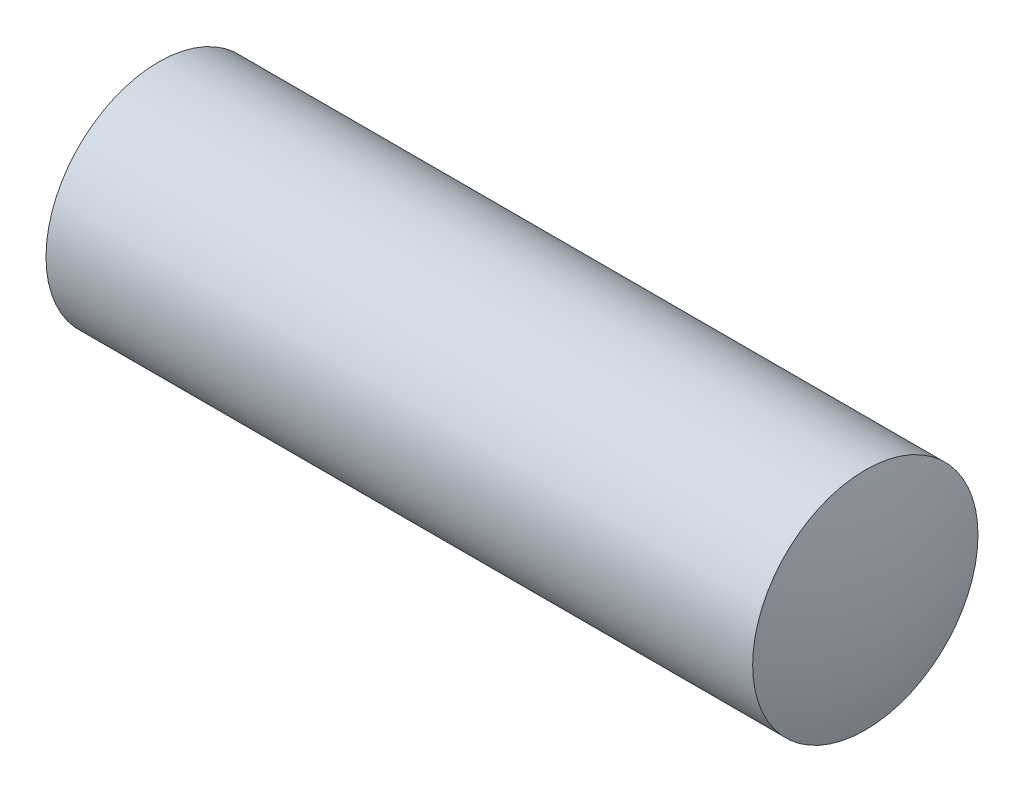
ISO-10303-21;
HEADER;
FILE_DESCRIPTION(('STEP AP214'),'2;1');
FILE_NAME('part.step','',(''),(''),'','','');
FILE_SCHEMA(('AUTOMOTIVE_DESIGN { 1 0 10303 214 1 1 1 1 }'));
ENDSEC;
DATA;
#1=APPLICATION_CONTEXT('core data for automotive mechanical design processes');
#2=APPLICATION_PROTOCOL_DEFINITION('international standard','automotive_design',2000,#1);
#3=PRODUCT_CONTEXT('',#1,'mechanical');
#4=PRODUCT('Part','Part','',(#3));
#5=PRODUCT_RELATED_PRODUCT_CATEGORY('part','',(#4));
#6=PRODUCT_DEFINITION_FORMATION('','',#4);
#7=PRODUCT_DEFINITION_CONTEXT('part definition',#1,'design');
#8=PRODUCT_DEFINITION('design','',#6,#7);
#9=PRODUCT_DEFINITION_SHAPE('','',#8);
#10=(LENGTH_UNIT() NAMED_UNIT(*) SI_UNIT(.MILLI.,.METRE.));
#11=(NAMED_UNIT(*) PLANE_ANGLE_UNIT() SI_UNIT($,.RADIAN.));
#12=(NAMED_UNIT(*) SI_UNIT($,.STERADIAN.) SOLID_ANGLE_UNIT());
#13=UNCERTAINTY_MEASURE_WITH_UNIT(LENGTH_MEASURE(1.E-05),#10,'distance_accuracy_value','');
#14=(GEOMETRIC_REPRESENTATION_CONTEXT(3) GLOBAL_UNCERTAINTY_ASSIGNED_CONTEXT((#13)) GLOBAL_UNIT_ASSIGNED_CONTEXT((#10,
#11,#12)) REPRESENTATION_CONTEXT('',''));
#15=CARTESIAN_POINT('',(0.,0.,0.));
#16=DIRECTION('',(0.,0.,1.));
#17=DIRECTION('',(1.,0.,0.));
#18=AXIS2_PLACEMENT_3D('',#15,#16,#17);
#19=CARTESIAN_POINT('',(0.25,0.,0.));
#20=DIRECTION('',(-1.,0.,0.));
#21=DIRECTION('',(0.,1.,0.));
#22=AXIS2_PLACEMENT_3D('',#19,#20,#21);
#23=SPHERICAL_SURFACE('',#22,19.5);
#24=CARTESIAN_POINT('',(18.8039753152795,0.,0.));
#25=DIRECTION('',(-1.,0.,0.));
#26=DIRECTION('',(0.,-1.,0.));
#27=AXIS2_PLACEMENT_3D('',#24,#25,#26);
#28=CIRCLE('',#27,6.);
#29=CARTESIAN_POINT('',(18.8039753152795,-6.,0.));
#30=VERTEX_POINT('',#29);
#31=EDGE_CURVE('E40',#30,#30,#28,.T.);
#32=ORIENTED_EDGE('',*,*,#31,.F.);
#33=EDGE_LOOP('',(#32));
#34=FACE_BOUND('',#33,.T.);
#35=ADVANCED_FACE('F34',(#34),#23,.T.);
#36=CARTESIAN_POINT('',(0.25,0.,0.));
#37=DIRECTION('',(-1.,0.,0.));
#38=DIRECTION('',(0.,1.,0.));
#39=AXIS2_PLACEMENT_3D('',#36,#37,#38);
#40=SPHERICAL_SURFACE('',#39,20.);
#41=CARTESIAN_POINT('',(-18.8287840283389,0.,0.));
#42=DIRECTION('',(-1.,0.,0.));
#43=DIRECTION('',(0.,-1.,0.));
#44=AXIS2_PLACEMENT_3D('',#41,#42,#43);
#45=CIRCLE('',#44,5.99999999999999);
#46=CARTESIAN_POINT('',(-18.8287840283389,-5.99999999999999,0.));
#47=VERTEX_POINT('',#46);
#48=EDGE_CURVE('E10',#47,#47,#45,.T.);
#49=ORIENTED_EDGE('',*,*,#48,.T.);
#50=EDGE_LOOP('',(#49));
#51=FACE_BOUND('',#50,.T.);
#52=ADVANCED_FACE('F49',(#51),#40,.T.);
#53=CARTESIAN_POINT('',(-19.9596765529134,0.,0.));
#54=DIRECTION('',(-1.,0.,0.));
#55=DIRECTION('',(0.,-1.,0.));
#56=AXIS2_PLACEMENT_3D('',#53,#54,#55);
#57=CYLINDRICAL_SURFACE('',#56,6.);
#58=ORIENTED_EDGE('',*,*,#48,.F.);
#59=EDGE_LOOP('',(#58));
#60=FACE_BOUND('',#59,.T.);
#61=ORIENTED_EDGE('',*,*,#31,.T.);
#62=EDGE_LOOP('',(#61));
#63=FACE_BOUND('',#62,.T.);
#64=ADVANCED_FACE('F46',(#60,#63),#57,.T.);
#65=CLOSED_SHELL('',(#35,#52,#64));
#66=MANIFOLD_SOLID_BREP('B2',#65);
#67=ADVANCED_BREP_SHAPE_REPRESENTATION('',(#18,#66),#14);
#68=SHAPE_DEFINITION_REPRESENTATION(#9,#67);
ENDSEC;
END-ISO-10303-21;
